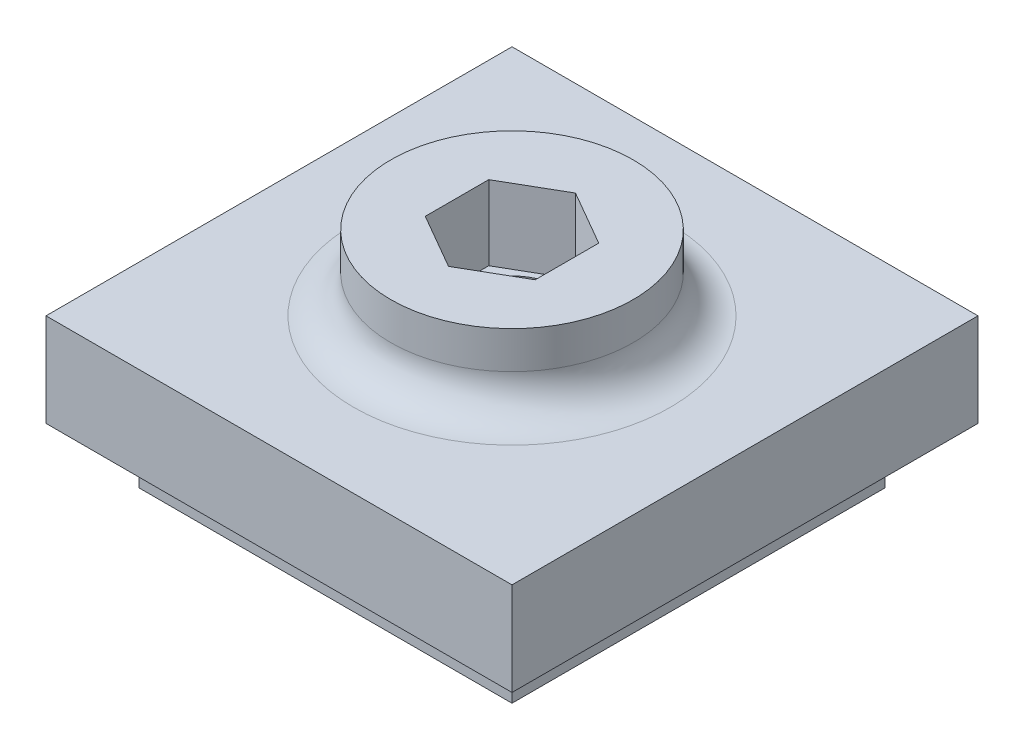
ISO-10303-21;
HEADER;
FILE_DESCRIPTION(('STEP AP214'),'2;1');
FILE_NAME('part.step','',(''),(''),'','','');
FILE_SCHEMA(('AUTOMOTIVE_DESIGN { 1 0 10303 214 1 1 1 1 }'));
ENDSEC;
DATA;
#1=APPLICATION_CONTEXT('core data for automotive mechanical design processes');
#2=APPLICATION_PROTOCOL_DEFINITION('international standard','automotive_design',2000,#1);
#3=PRODUCT_CONTEXT('',#1,'mechanical');
#4=PRODUCT('Part','Part','',(#3));
#5=PRODUCT_RELATED_PRODUCT_CATEGORY('part','',(#4));
#6=PRODUCT_DEFINITION_FORMATION('','',#4);
#7=PRODUCT_DEFINITION_CONTEXT('part definition',#1,'design');
#8=PRODUCT_DEFINITION('design','',#6,#7);
#9=PRODUCT_DEFINITION_SHAPE('','',#8);
#10=(LENGTH_UNIT() NAMED_UNIT(*) SI_UNIT(.MILLI.,.METRE.));
#11=(NAMED_UNIT(*) PLANE_ANGLE_UNIT() SI_UNIT($,.RADIAN.));
#12=(NAMED_UNIT(*) SI_UNIT($,.STERADIAN.) SOLID_ANGLE_UNIT());
#13=UNCERTAINTY_MEASURE_WITH_UNIT(LENGTH_MEASURE(1.E-05),#10,'distance_accuracy_value','');
#14=(GEOMETRIC_REPRESENTATION_CONTEXT(3) GLOBAL_UNCERTAINTY_ASSIGNED_CONTEXT((#13)) GLOBAL_UNIT_ASSIGNED_CONTEXT((#10,
#11,#12)) REPRESENTATION_CONTEXT('',''));
#15=CARTESIAN_POINT('',(0.,0.,0.));
#16=DIRECTION('',(0.,0.,1.));
#17=DIRECTION('',(1.,0.,0.));
#18=AXIS2_PLACEMENT_3D('',#15,#16,#17);
#19=CARTESIAN_POINT('',(0.,-3.,0.));
#20=DIRECTION('',(0.,1.,0.));
#21=DIRECTION('',(0.,0.,1.));
#22=AXIS2_PLACEMENT_3D('',#19,#20,#21);
#23=CYLINDRICAL_SURFACE('',#22,2.62000000000002);
#24=CARTESIAN_POINT('',(0.,-3.,0.));
#25=DIRECTION('',(0.,1.,0.));
#26=DIRECTION('',(0.,0.,1.));
#27=AXIS2_PLACEMENT_3D('',#24,#25,#26);
#28=CIRCLE('',#27,2.62000000000002);
#29=CARTESIAN_POINT('',(0.,-3.,2.62000000000002));
#30=VERTEX_POINT('',#29);
#31=EDGE_CURVE('E186',#30,#30,#28,.T.);
#32=ORIENTED_EDGE('',*,*,#31,.F.);
#33=EDGE_LOOP('',(#32));
#34=FACE_BOUND('',#33,.T.);
#35=CARTESIAN_POINT('',(0.,5.,0.));
#36=DIRECTION('',(0.,1.,0.));
#37=DIRECTION('',(0.,0.,1.));
#38=AXIS2_PLACEMENT_3D('',#35,#36,#37);
#39=CIRCLE('',#38,2.62000000000002);
#40=CARTESIAN_POINT('',(0.,5.,2.62000000000002));
#41=VERTEX_POINT('',#40);
#42=EDGE_CURVE('E184',#41,#41,#39,.F.);
#43=ORIENTED_EDGE('',*,*,#42,.F.);
#44=EDGE_LOOP('',(#43));
#45=FACE_BOUND('',#44,.T.);
#46=ADVANCED_FACE('F38',(#34,#45),#23,.F.);
#47=CARTESIAN_POINT('',(0.,0.,0.));
#48=DIRECTION('',(0.,1.,0.));
#49=DIRECTION('',(0.,0.,1.));
#50=AXIS2_PLACEMENT_3D('',#47,#48,#49);
#51=PLANE('',#50);
#52=DIRECTION('',(0.,0.,-1.));
#53=VECTOR('',#52,1.);
#54=CARTESIAN_POINT('',(-12.5000000000001,0.,0.));
#55=LINE('',#54,#53);
#56=CARTESIAN_POINT('',(-12.5000000000001,0.,12.5));
#57=VERTEX_POINT('',#56);
#58=CARTESIAN_POINT('',(-12.5000000000001,0.,-12.5));
#59=VERTEX_POINT('',#58);
#60=EDGE_CURVE('E222',#57,#59,#55,.T.);
#61=ORIENTED_EDGE('',*,*,#60,.T.);
#62=DIRECTION('',(1.,0.,0.));
#63=VECTOR('',#62,1.);
#64=CARTESIAN_POINT('',(0.,0.,-12.5));
#65=LINE('',#64,#63);
#66=CARTESIAN_POINT('',(12.5,0.,-12.5));
#67=VERTEX_POINT('',#66);
#68=EDGE_CURVE('E227',#59,#67,#65,.T.);
#69=ORIENTED_EDGE('',*,*,#68,.T.);
#70=DIRECTION('',(0.,0.,-1.));
#71=VECTOR('',#70,1.);
#72=CARTESIAN_POINT('',(12.5,0.,0.));
#73=LINE('',#72,#71);
#74=CARTESIAN_POINT('',(12.5,0.,12.5));
#75=VERTEX_POINT('',#74);
#76=EDGE_CURVE('E239',#75,#67,#73,.T.);
#77=ORIENTED_EDGE('',*,*,#76,.F.);
#78=DIRECTION('',(1.,0.,0.));
#79=VECTOR('',#78,1.);
#80=CARTESIAN_POINT('',(0.,0.,12.5));
#81=LINE('',#80,#79);
#82=EDGE_CURVE('E237',#57,#75,#81,.T.);
#83=ORIENTED_EDGE('',*,*,#82,.F.);
#84=EDGE_LOOP('',(#61,#69,#77,#83));
#85=FACE_BOUND('',#84,.T.);
#86=DIRECTION('',(0.,0.,-1.));
#87=VECTOR('',#86,1.);
#88=CARTESIAN_POINT('',(-10.0000000000001,0.,9.99999999999999));
#89=LINE('',#88,#87);
#90=CARTESIAN_POINT('',(-10.0000000000001,0.,9.99999999999999));
#91=VERTEX_POINT('',#90);
#92=CARTESIAN_POINT('',(-10.0000000000001,0.,-10.));
#93=VERTEX_POINT('',#92);
#94=EDGE_CURVE('E61',#91,#93,#89,.T.);
#95=ORIENTED_EDGE('',*,*,#94,.F.);
#96=DIRECTION('',(-1.,0.,0.));
#97=VECTOR('',#96,1.);
#98=CARTESIAN_POINT('',(-10.0000000000001,0.,9.99999999999999));
#99=LINE('',#98,#97);
#100=CARTESIAN_POINT('',(9.99999999999995,0.,9.99999999999999));
#101=VERTEX_POINT('',#100);
#102=EDGE_CURVE('E196',#101,#91,#99,.T.);
#103=ORIENTED_EDGE('',*,*,#102,.F.);
#104=DIRECTION('',(0.,0.,1.));
#105=VECTOR('',#104,1.);
#106=CARTESIAN_POINT('',(9.99999999999995,0.,9.99999999999999));
#107=LINE('',#106,#105);
#108=CARTESIAN_POINT('',(9.99999999999995,0.,-10.));
#109=VERTEX_POINT('',#108);
#110=EDGE_CURVE('E207',#109,#101,#107,.T.);
#111=ORIENTED_EDGE('',*,*,#110,.F.);
#112=DIRECTION('',(1.,0.,0.));
#113=VECTOR('',#112,1.);
#114=CARTESIAN_POINT('',(-10.0000000000001,0.,-10.));
#115=LINE('',#114,#113);
#116=EDGE_CURVE('E204',#93,#109,#115,.T.);
#117=ORIENTED_EDGE('',*,*,#116,.F.);
#118=EDGE_LOOP('',(#95,#103,#111,#117));
#119=FACE_BOUND('',#118,.T.);
#120=ADVANCED_FACE('F267',(#85,#119),#51,.F.);
#121=CARTESIAN_POINT('',(-12.5000000000001,5.,0.));
#122=DIRECTION('',(-1.,0.,0.));
#123=DIRECTION('',(0.,0.,1.));
#124=AXIS2_PLACEMENT_3D('',#121,#122,#123);
#125=PLANE('',#124);
#126=ORIENTED_EDGE('',*,*,#60,.F.);
#127=DIRECTION('',(0.,-1.,0.));
#128=VECTOR('',#127,1.);
#129=CARTESIAN_POINT('',(-12.5000000000001,5.,12.5));
#130=LINE('',#129,#128);
#131=CARTESIAN_POINT('',(-12.5000000000001,5.,12.5));
#132=VERTEX_POINT('',#131);
#133=EDGE_CURVE('E250',#132,#57,#130,.T.);
#134=ORIENTED_EDGE('',*,*,#133,.F.);
#135=DIRECTION('',(0.,0.,-1.));
#136=VECTOR('',#135,1.);
#137=CARTESIAN_POINT('',(-12.5000000000001,5.,0.));
#138=LINE('',#137,#136);
#139=CARTESIAN_POINT('',(-12.5000000000001,5.,-12.5));
#140=VERTEX_POINT('',#139);
#141=EDGE_CURVE('E223',#132,#140,#138,.T.);
#142=ORIENTED_EDGE('',*,*,#141,.T.);
#143=DIRECTION('',(0.,-1.,0.));
#144=VECTOR('',#143,1.);
#145=CARTESIAN_POINT('',(-12.5000000000001,5.,-12.5));
#146=LINE('',#145,#144);
#147=EDGE_CURVE('E234',#140,#59,#146,.T.);
#148=ORIENTED_EDGE('',*,*,#147,.T.);
#149=EDGE_LOOP('',(#126,#134,#142,#148));
#150=FACE_BOUND('',#149,.T.);
#151=ADVANCED_FACE('F273',(#150),#125,.T.);
#152=CARTESIAN_POINT('',(0.,5.,12.5));
#153=DIRECTION('',(0.,0.,-1.));
#154=DIRECTION('',(-1.,0.,0.));
#155=AXIS2_PLACEMENT_3D('',#152,#153,#154);
#156=PLANE('',#155);
#157=ORIENTED_EDGE('',*,*,#82,.T.);
#158=DIRECTION('',(0.,-1.,0.));
#159=VECTOR('',#158,1.);
#160=CARTESIAN_POINT('',(12.5,5.,12.5));
#161=LINE('',#160,#159);
#162=CARTESIAN_POINT('',(12.5,5.,12.5));
#163=VERTEX_POINT('',#162);
#164=EDGE_CURVE('E247',#163,#75,#161,.T.);
#165=ORIENTED_EDGE('',*,*,#164,.F.);
#166=DIRECTION('',(1.,0.,0.));
#167=VECTOR('',#166,1.);
#168=CARTESIAN_POINT('',(0.,5.,12.5));
#169=LINE('',#168,#167);
#170=EDGE_CURVE('E226',#132,#163,#169,.T.);
#171=ORIENTED_EDGE('',*,*,#170,.F.);
#172=ORIENTED_EDGE('',*,*,#133,.T.);
#173=EDGE_LOOP('',(#157,#165,#171,#172));
#174=FACE_BOUND('',#173,.T.);
#175=ADVANCED_FACE('F317',(#174),#156,.F.);
#176=CARTESIAN_POINT('',(12.5,5.,0.));
#177=DIRECTION('',(-1.,0.,0.));
#178=DIRECTION('',(0.,0.,1.));
#179=AXIS2_PLACEMENT_3D('',#176,#177,#178);
#180=PLANE('',#179);
#181=ORIENTED_EDGE('',*,*,#76,.T.);
#182=DIRECTION('',(0.,-1.,0.));
#183=VECTOR('',#182,1.);
#184=CARTESIAN_POINT('',(12.5,5.,-12.5));
#185=LINE('',#184,#183);
#186=CARTESIAN_POINT('',(12.5,5.,-12.5));
#187=VERTEX_POINT('',#186);
#188=EDGE_CURVE('E245',#187,#67,#185,.T.);
#189=ORIENTED_EDGE('',*,*,#188,.F.);
#190=DIRECTION('',(0.,0.,-1.));
#191=VECTOR('',#190,1.);
#192=CARTESIAN_POINT('',(12.5,5.,0.));
#193=LINE('',#192,#191);
#194=EDGE_CURVE('E229',#163,#187,#193,.T.);
#195=ORIENTED_EDGE('',*,*,#194,.F.);
#196=ORIENTED_EDGE('',*,*,#164,.T.);
#197=EDGE_LOOP('',(#181,#189,#195,#196));
#198=FACE_BOUND('',#197,.T.);
#199=ADVANCED_FACE('F313',(#198),#180,.F.);
#200=CARTESIAN_POINT('',(0.,5.,-12.5));
#201=DIRECTION('',(0.,0.,-1.));
#202=DIRECTION('',(-1.,0.,0.));
#203=AXIS2_PLACEMENT_3D('',#200,#201,#202);
#204=PLANE('',#203);
#205=ORIENTED_EDGE('',*,*,#68,.F.);
#206=ORIENTED_EDGE('',*,*,#147,.F.);
#207=DIRECTION('',(1.,0.,0.));
#208=VECTOR('',#207,1.);
#209=CARTESIAN_POINT('',(0.,5.,-12.5));
#210=LINE('',#209,#208);
#211=EDGE_CURVE('E231',#140,#187,#210,.T.);
#212=ORIENTED_EDGE('',*,*,#211,.T.);
#213=ORIENTED_EDGE('',*,*,#188,.T.);
#214=EDGE_LOOP('',(#205,#206,#212,#213));
#215=FACE_BOUND('',#214,.T.);
#216=ADVANCED_FACE('F308',(#215),#204,.T.);
#217=CARTESIAN_POINT('',(0.,5.,0.));
#218=DIRECTION('',(0.,1.,0.));
#219=DIRECTION('',(0.,0.,1.));
#220=AXIS2_PLACEMENT_3D('',#217,#218,#219);
#221=PLANE('',#220);
#222=CARTESIAN_POINT('',(0.,5.,0.));
#223=DIRECTION('',(0.,1.,0.));
#224=DIRECTION('',(0.,0.,1.));
#225=AXIS2_PLACEMENT_3D('',#222,#223,#224);
#226=CIRCLE('',#225,8.50000000000001);
#227=CARTESIAN_POINT('',(0.,5.,8.50000000000001));
#228=VERTEX_POINT('',#227);
#229=EDGE_CURVE('E11',#228,#228,#226,.F.);
#230=ORIENTED_EDGE('',*,*,#229,.T.);
#231=EDGE_LOOP('',(#230));
#232=FACE_BOUND('',#231,.T.);
#233=ORIENTED_EDGE('',*,*,#141,.F.);
#234=ORIENTED_EDGE('',*,*,#170,.T.);
#235=ORIENTED_EDGE('',*,*,#194,.T.);
#236=ORIENTED_EDGE('',*,*,#211,.F.);
#237=EDGE_LOOP('',(#233,#234,#235,#236));
#238=FACE_BOUND('',#237,.T.);
#239=ADVANCED_FACE('F305',(#232,#238),#221,.T.);
#240=CARTESIAN_POINT('',(-10.0000000000001,-3.,9.99999999999999));
#241=DIRECTION('',(1.,0.,0.));
#242=DIRECTION('',(0.,0.,-1.));
#243=AXIS2_PLACEMENT_3D('',#240,#241,#242);
#244=PLANE('',#243);
#245=ORIENTED_EDGE('',*,*,#94,.T.);
#246=DIRECTION('',(0.,1.,0.));
#247=VECTOR('',#246,1.);
#248=CARTESIAN_POINT('',(-10.0000000000001,-3.,-10.));
#249=LINE('',#248,#247);
#250=CARTESIAN_POINT('',(-10.0000000000001,-3.,-10.));
#251=VERTEX_POINT('',#250);
#252=EDGE_CURVE('E219',#251,#93,#249,.T.);
#253=ORIENTED_EDGE('',*,*,#252,.F.);
#254=DIRECTION('',(0.,0.,-1.));
#255=VECTOR('',#254,1.);
#256=CARTESIAN_POINT('',(-10.0000000000001,-3.,9.99999999999999));
#257=LINE('',#256,#255);
#258=CARTESIAN_POINT('',(-10.0000000000001,-3.,9.99999999999999));
#259=VERTEX_POINT('',#258);
#260=EDGE_CURVE('E192',#259,#251,#257,.T.);
#261=ORIENTED_EDGE('',*,*,#260,.F.);
#262=DIRECTION('',(0.,1.,0.));
#263=VECTOR('',#262,1.);
#264=CARTESIAN_POINT('',(-10.0000000000001,-3.,9.99999999999999));
#265=LINE('',#264,#263);
#266=EDGE_CURVE('E202',#259,#91,#265,.T.);
#267=ORIENTED_EDGE('',*,*,#266,.T.);
#268=EDGE_LOOP('',(#245,#253,#261,#267));
#269=FACE_BOUND('',#268,.T.);
#270=ADVANCED_FACE('F301',(#269),#244,.F.);
#271=CARTESIAN_POINT('',(-10.0000000000001,-3.,-10.));
#272=DIRECTION('',(0.,0.,1.));
#273=DIRECTION('',(1.,0.,0.));
#274=AXIS2_PLACEMENT_3D('',#271,#272,#273);
#275=PLANE('',#274);
#276=ORIENTED_EDGE('',*,*,#116,.T.);
#277=DIRECTION('',(0.,1.,0.));
#278=VECTOR('',#277,1.);
#279=CARTESIAN_POINT('',(9.99999999999995,-3.,-10.));
#280=LINE('',#279,#278);
#281=CARTESIAN_POINT('',(9.99999999999995,-3.,-10.));
#282=VERTEX_POINT('',#281);
#283=EDGE_CURVE('E216',#282,#109,#280,.T.);
#284=ORIENTED_EDGE('',*,*,#283,.F.);
#285=DIRECTION('',(1.,0.,0.));
#286=VECTOR('',#285,1.);
#287=CARTESIAN_POINT('',(-10.0000000000001,-3.,-10.));
#288=LINE('',#287,#286);
#289=EDGE_CURVE('E195',#251,#282,#288,.T.);
#290=ORIENTED_EDGE('',*,*,#289,.F.);
#291=ORIENTED_EDGE('',*,*,#252,.T.);
#292=EDGE_LOOP('',(#276,#284,#290,#291));
#293=FACE_BOUND('',#292,.T.);
#294=ADVANCED_FACE('F297',(#293),#275,.F.);
#295=CARTESIAN_POINT('',(9.99999999999995,-3.,9.99999999999999));
#296=DIRECTION('',(-1.,0.,0.));
#297=DIRECTION('',(0.,0.,1.));
#298=AXIS2_PLACEMENT_3D('',#295,#296,#297);
#299=PLANE('',#298);
#300=ORIENTED_EDGE('',*,*,#110,.T.);
#301=DIRECTION('',(0.,1.,0.));
#302=VECTOR('',#301,1.);
#303=CARTESIAN_POINT('',(9.99999999999995,-3.,9.99999999999999));
#304=LINE('',#303,#302);
#305=CARTESIAN_POINT('',(9.99999999999995,-3.,9.99999999999999));
#306=VERTEX_POINT('',#305);
#307=EDGE_CURVE('E213',#306,#101,#304,.T.);
#308=ORIENTED_EDGE('',*,*,#307,.F.);
#309=DIRECTION('',(0.,0.,1.));
#310=VECTOR('',#309,1.);
#311=CARTESIAN_POINT('',(9.99999999999995,-3.,9.99999999999999));
#312=LINE('',#311,#310);
#313=EDGE_CURVE('E198',#282,#306,#312,.T.);
#314=ORIENTED_EDGE('',*,*,#313,.F.);
#315=ORIENTED_EDGE('',*,*,#283,.T.);
#316=EDGE_LOOP('',(#300,#308,#314,#315));
#317=FACE_BOUND('',#316,.T.);
#318=ADVANCED_FACE('F293',(#317),#299,.F.);
#319=CARTESIAN_POINT('',(-10.0000000000001,-3.,9.99999999999999));
#320=DIRECTION('',(0.,0.,-1.));
#321=DIRECTION('',(-1.,0.,0.));
#322=AXIS2_PLACEMENT_3D('',#319,#320,#321);
#323=PLANE('',#322);
#324=ORIENTED_EDGE('',*,*,#102,.T.);
#325=ORIENTED_EDGE('',*,*,#266,.F.);
#326=DIRECTION('',(-1.,0.,0.));
#327=VECTOR('',#326,1.);
#328=CARTESIAN_POINT('',(-10.0000000000001,-3.,9.99999999999999));
#329=LINE('',#328,#327);
#330=EDGE_CURVE('E200',#306,#259,#329,.T.);
#331=ORIENTED_EDGE('',*,*,#330,.F.);
#332=ORIENTED_EDGE('',*,*,#307,.T.);
#333=EDGE_LOOP('',(#324,#325,#331,#332));
#334=FACE_BOUND('',#333,.T.);
#335=ADVANCED_FACE('F289',(#334),#323,.F.);
#336=CARTESIAN_POINT('',(0.,-3.,0.));
#337=DIRECTION('',(0.,-1.,0.));
#338=DIRECTION('',(0.,0.,-1.));
#339=AXIS2_PLACEMENT_3D('',#336,#337,#338);
#340=PLANE('',#339);
#341=ORIENTED_EDGE('',*,*,#31,.T.);
#342=EDGE_LOOP('',(#341));
#343=FACE_BOUND('',#342,.T.);
#344=ORIENTED_EDGE('',*,*,#260,.T.);
#345=ORIENTED_EDGE('',*,*,#289,.T.);
#346=ORIENTED_EDGE('',*,*,#313,.T.);
#347=ORIENTED_EDGE('',*,*,#330,.T.);
#348=EDGE_LOOP('',(#344,#345,#346,#347));
#349=FACE_BOUND('',#348,.T.);
#350=ADVANCED_FACE('F286',(#343,#349),#340,.T.);
#351=CARTESIAN_POINT('',(0.,9.,0.));
#352=DIRECTION('',(0.,-1.,0.));
#353=DIRECTION('',(0.,0.,-1.));
#354=AXIS2_PLACEMENT_3D('',#351,#352,#353);
#355=CYLINDRICAL_SURFACE('',#354,6.50000000000001);
#356=CARTESIAN_POINT('',(0.,7.,0.));
#357=DIRECTION('',(0.,1.,0.));
#358=DIRECTION('',(0.,0.,1.));
#359=AXIS2_PLACEMENT_3D('',#356,#357,#358);
#360=CIRCLE('',#359,6.50000000000001);
#361=CARTESIAN_POINT('',(0.,7.,6.50000000000001));
#362=VERTEX_POINT('',#361);
#363=EDGE_CURVE('E46',#362,#362,#360,.T.);
#364=ORIENTED_EDGE('',*,*,#363,.T.);
#365=EDGE_LOOP('',(#364));
#366=FACE_BOUND('',#365,.T.);
#367=CARTESIAN_POINT('',(0.,9.,0.));
#368=DIRECTION('',(0.,1.,0.));
#369=DIRECTION('',(0.,0.,1.));
#370=AXIS2_PLACEMENT_3D('',#367,#368,#369);
#371=CIRCLE('',#370,6.50000000000001);
#372=CARTESIAN_POINT('',(0.,9.,6.50000000000001));
#373=VERTEX_POINT('',#372);
#374=EDGE_CURVE('E189',#373,#373,#371,.T.);
#375=ORIENTED_EDGE('',*,*,#374,.F.);
#376=EDGE_LOOP('',(#375));
#377=FACE_BOUND('',#376,.T.);
#378=ADVANCED_FACE('F256',(#366,#377),#355,.T.);
#379=CARTESIAN_POINT('',(0.,9.,0.));
#380=DIRECTION('',(0.,1.,0.));
#381=DIRECTION('',(0.,0.,1.));
#382=AXIS2_PLACEMENT_3D('',#379,#380,#381);
#383=PLANE('',#382);
#384=DIRECTION('',(-0.86602540378444,0.,-0.499999999999998));
#385=VECTOR('',#384,1.);
#386=CARTESIAN_POINT('',(2.94999999999995,9.,-1.70318329410937));
#387=LINE('',#386,#385);
#388=CARTESIAN_POINT('',(2.94999999999995,9.,-1.70318329410937));
#389=VERTEX_POINT('',#388);
#390=CARTESIAN_POINT('',(0.,9.,-3.40636658821877));
#391=VERTEX_POINT('',#390);
#392=EDGE_CURVE('E53',#389,#391,#387,.T.);
#393=ORIENTED_EDGE('',*,*,#392,.F.);
#394=DIRECTION('',(0.,0.,-1.));
#395=VECTOR('',#394,1.);
#396=CARTESIAN_POINT('',(2.94999999999995,9.,1.70318329410941));
#397=LINE('',#396,#395);
#398=CARTESIAN_POINT('',(2.94999999999995,9.,1.70318329410941));
#399=VERTEX_POINT('',#398);
#400=EDGE_CURVE('E171',#399,#389,#397,.T.);
#401=ORIENTED_EDGE('',*,*,#400,.F.);
#402=DIRECTION('',(0.86602540378444,0.,-0.499999999999997));
#403=VECTOR('',#402,1.);
#404=CARTESIAN_POINT('',(0.,9.,3.40636658821879));
#405=LINE('',#404,#403);
#406=CARTESIAN_POINT('',(0.,9.,3.40636658821879));
#407=VERTEX_POINT('',#406);
#408=EDGE_CURVE('E165',#407,#399,#405,.T.);
#409=ORIENTED_EDGE('',*,*,#408,.F.);
#410=DIRECTION('',(0.866025403784437,0.,0.500000000000002));
#411=VECTOR('',#410,1.);
#412=CARTESIAN_POINT('',(-2.95000000000001,9.,1.70318329410941));
#413=LINE('',#412,#411);
#414=CARTESIAN_POINT('',(-2.95000000000001,9.,1.70318329410941));
#415=VERTEX_POINT('',#414);
#416=EDGE_CURVE('E163',#415,#407,#413,.T.);
#417=ORIENTED_EDGE('',*,*,#416,.F.);
#418=DIRECTION('',(0.,0.,1.));
#419=VECTOR('',#418,1.);
#420=CARTESIAN_POINT('',(-2.95000000000001,9.,-1.70318329410939));
#421=LINE('',#420,#419);
#422=CARTESIAN_POINT('',(-2.95000000000001,9.,-1.70318329410939));
#423=VERTEX_POINT('',#422);
#424=EDGE_CURVE('E145',#423,#415,#421,.T.);
#425=ORIENTED_EDGE('',*,*,#424,.F.);
#426=DIRECTION('',(-0.866025403784437,0.,0.500000000000002));
#427=VECTOR('',#426,1.);
#428=CARTESIAN_POINT('',(0.,9.,-3.40636658821877));
#429=LINE('',#428,#427);
#430=EDGE_CURVE('E155',#391,#423,#429,.T.);
#431=ORIENTED_EDGE('',*,*,#430,.F.);
#432=EDGE_LOOP('',(#393,#401,#409,#417,#425,#431));
#433=FACE_BOUND('',#432,.T.);
#434=ORIENTED_EDGE('',*,*,#374,.T.);
#435=EDGE_LOOP('',(#434));
#436=FACE_BOUND('',#435,.T.);
#437=ADVANCED_FACE('F159',(#433,#436),#383,.T.);
#438=CARTESIAN_POINT('',(0.,5.,0.));
#439=DIRECTION('',(0.,1.,0.));
#440=DIRECTION('',(0.,0.,1.));
#441=AXIS2_PLACEMENT_3D('',#438,#439,#440);
#442=PLANE('',#441);
#443=DIRECTION('',(0.86602540378444,0.,0.499999999999999));
#444=VECTOR('',#443,1.);
#445=CARTESIAN_POINT('',(2.94999999999995,5.,-1.70318329410937));
#446=LINE('',#445,#444);
#447=CARTESIAN_POINT('',(0.,5.,-3.40636658821877));
#448=VERTEX_POINT('',#447);
#449=CARTESIAN_POINT('',(2.94999999999995,5.,-1.70318329410937));
#450=VERTEX_POINT('',#449);
#451=EDGE_CURVE('E185',#448,#450,#446,.T.);
#452=ORIENTED_EDGE('',*,*,#451,.F.);
#453=DIRECTION('',(0.866025403784437,0.,-0.500000000000002));
#454=VECTOR('',#453,1.);
#455=CARTESIAN_POINT('',(0.,5.,-3.40636658821877));
#456=LINE('',#455,#454);
#457=CARTESIAN_POINT('',(-2.95000000000001,5.,-1.70318329410939));
#458=VERTEX_POINT('',#457);
#459=EDGE_CURVE('E182',#458,#448,#456,.T.);
#460=ORIENTED_EDGE('',*,*,#459,.F.);
#461=DIRECTION('',(0.,0.,-1.));
#462=VECTOR('',#461,1.);
#463=CARTESIAN_POINT('',(-2.95000000000001,5.,-1.70318329410939));
#464=LINE('',#463,#462);
#465=CARTESIAN_POINT('',(-2.95000000000001,5.,1.70318329410941));
#466=VERTEX_POINT('',#465);
#467=EDGE_CURVE('E148',#466,#458,#464,.T.);
#468=ORIENTED_EDGE('',*,*,#467,.F.);
#469=DIRECTION('',(-0.866025403784437,0.,-0.500000000000002));
#470=VECTOR('',#469,1.);
#471=CARTESIAN_POINT('',(-2.95000000000001,5.,1.70318329410941));
#472=LINE('',#471,#470);
#473=CARTESIAN_POINT('',(0.,5.,3.40636658821879));
#474=VERTEX_POINT('',#473);
#475=EDGE_CURVE('E535',#474,#466,#472,.T.);
#476=ORIENTED_EDGE('',*,*,#475,.F.);
#477=DIRECTION('',(-0.866025403784441,0.,0.499999999999997));
#478=VECTOR('',#477,1.);
#479=CARTESIAN_POINT('',(0.,5.,3.40636658821879));
#480=LINE('',#479,#478);
#481=CARTESIAN_POINT('',(2.94999999999995,5.,1.70318329410941));
#482=VERTEX_POINT('',#481);
#483=EDGE_CURVE('E537',#482,#474,#480,.T.);
#484=ORIENTED_EDGE('',*,*,#483,.F.);
#485=DIRECTION('',(0.,0.,1.));
#486=VECTOR('',#485,1.);
#487=CARTESIAN_POINT('',(2.94999999999995,5.,1.70318329410941));
#488=LINE('',#487,#486);
#489=EDGE_CURVE('E544',#450,#482,#488,.T.);
#490=ORIENTED_EDGE('',*,*,#489,.F.);
#491=EDGE_LOOP('',(#452,#460,#468,#476,#484,#490));
#492=FACE_BOUND('',#491,.T.);
#493=ORIENTED_EDGE('',*,*,#42,.T.);
#494=EDGE_LOOP('',(#493));
#495=FACE_BOUND('',#494,.T.);
#496=ADVANCED_FACE('F283',(#492,#495),#442,.T.);
#497=CARTESIAN_POINT('',(2.94999999999995,-4.01239886674644,-1.70318329410937));
#498=DIRECTION('',(0.499999999999999,0.,-0.86602540378444));
#499=DIRECTION('',(-0.86602540378444,0.,-0.499999999999999));
#500=AXIS2_PLACEMENT_3D('',#497,#498,#499);
#501=PLANE('',#500);
#502=ORIENTED_EDGE('',*,*,#451,.T.);
#503=DIRECTION('',(0.,1.,0.));
#504=VECTOR('',#503,1.);
#505=CARTESIAN_POINT('',(2.94999999999995,-4.01239886674644,-1.70318329410937));
#506=LINE('',#505,#504);
#507=EDGE_CURVE('E174',#450,#389,#506,.T.);
#508=ORIENTED_EDGE('',*,*,#507,.T.);
#509=ORIENTED_EDGE('',*,*,#392,.T.);
#510=DIRECTION('',(0.,1.,0.));
#511=VECTOR('',#510,1.);
#512=CARTESIAN_POINT('',(0.,-4.01239886674644,-3.40636658821877));
#513=LINE('',#512,#511);
#514=EDGE_CURVE('E152',#448,#391,#513,.T.);
#515=ORIENTED_EDGE('',*,*,#514,.F.);
#516=EDGE_LOOP('',(#502,#508,#509,#515));
#517=FACE_BOUND('',#516,.T.);
#518=ADVANCED_FACE('F280',(#517),#501,.F.);
#519=CARTESIAN_POINT('',(2.94999999999995,-4.01239886674644,1.70318329410941));
#520=DIRECTION('',(1.,0.,0.));
#521=DIRECTION('',(0.,0.,-1.));
#522=AXIS2_PLACEMENT_3D('',#519,#520,#521);
#523=PLANE('',#522);
#524=ORIENTED_EDGE('',*,*,#489,.T.);
#525=DIRECTION('',(0.,1.,0.));
#526=VECTOR('',#525,1.);
#527=CARTESIAN_POINT('',(2.94999999999995,-4.01239886674644,1.70318329410941));
#528=LINE('',#527,#526);
#529=EDGE_CURVE('E176',#482,#399,#528,.T.);
#530=ORIENTED_EDGE('',*,*,#529,.T.);
#531=ORIENTED_EDGE('',*,*,#400,.T.);
#532=ORIENTED_EDGE('',*,*,#507,.F.);
#533=EDGE_LOOP('',(#524,#530,#531,#532));
#534=FACE_BOUND('',#533,.T.);
#535=ADVANCED_FACE('F396',(#534),#523,.F.);
#536=CARTESIAN_POINT('',(0.,-4.01239886674644,3.40636658821879));
#537=DIRECTION('',(0.499999999999997,0.,0.866025403784441));
#538=DIRECTION('',(0.866025403784441,0.,-0.499999999999997));
#539=AXIS2_PLACEMENT_3D('',#536,#537,#538);
#540=PLANE('',#539);
#541=ORIENTED_EDGE('',*,*,#483,.T.);
#542=DIRECTION('',(0.,1.,0.));
#543=VECTOR('',#542,1.);
#544=CARTESIAN_POINT('',(0.,-4.01239886674644,3.40636658821879));
#545=LINE('',#544,#543);
#546=EDGE_CURVE('E178',#474,#407,#545,.T.);
#547=ORIENTED_EDGE('',*,*,#546,.T.);
#548=ORIENTED_EDGE('',*,*,#408,.T.);
#549=ORIENTED_EDGE('',*,*,#529,.F.);
#550=EDGE_LOOP('',(#541,#547,#548,#549));
#551=FACE_BOUND('',#550,.T.);
#552=ADVANCED_FACE('F402',(#551),#540,.F.);
#553=CARTESIAN_POINT('',(-2.95000000000001,-4.01239886674644,1.70318329410941));
#554=DIRECTION('',(-0.500000000000002,0.,0.866025403784437));
#555=DIRECTION('',(0.866025403784437,0.,0.500000000000002));
#556=AXIS2_PLACEMENT_3D('',#553,#554,#555);
#557=PLANE('',#556);
#558=ORIENTED_EDGE('',*,*,#475,.T.);
#559=DIRECTION('',(0.,1.,0.));
#560=VECTOR('',#559,1.);
#561=CARTESIAN_POINT('',(-2.95000000000001,-4.01239886674644,1.70318329410941));
#562=LINE('',#561,#560);
#563=EDGE_CURVE('E151',#466,#415,#562,.T.);
#564=ORIENTED_EDGE('',*,*,#563,.T.);
#565=ORIENTED_EDGE('',*,*,#416,.T.);
#566=ORIENTED_EDGE('',*,*,#546,.F.);
#567=EDGE_LOOP('',(#558,#564,#565,#566));
#568=FACE_BOUND('',#567,.T.);
#569=ADVANCED_FACE('F410',(#568),#557,.F.);
#570=CARTESIAN_POINT('',(-2.95000000000001,-4.01239886674644,-1.70318329410939));
#571=DIRECTION('',(-1.,0.,0.));
#572=DIRECTION('',(0.,0.,1.));
#573=AXIS2_PLACEMENT_3D('',#570,#571,#572);
#574=PLANE('',#573);
#575=ORIENTED_EDGE('',*,*,#467,.T.);
#576=DIRECTION('',(0.,1.,0.));
#577=VECTOR('',#576,1.);
#578=CARTESIAN_POINT('',(-2.95000000000001,-4.01239886674644,-1.70318329410939));
#579=LINE('',#578,#577);
#580=EDGE_CURVE('E140',#458,#423,#579,.T.);
#581=ORIENTED_EDGE('',*,*,#580,.T.);
#582=ORIENTED_EDGE('',*,*,#424,.T.);
#583=ORIENTED_EDGE('',*,*,#563,.F.);
#584=EDGE_LOOP('',(#575,#581,#582,#583));
#585=FACE_BOUND('',#584,.T.);
#586=ADVANCED_FACE('F142',(#585),#574,.F.);
#587=CARTESIAN_POINT('',(0.,-4.01239886674644,-3.40636658821877));
#588=DIRECTION('',(-0.500000000000002,0.,-0.866025403784437));
#589=DIRECTION('',(-0.866025403784437,0.,0.500000000000002));
#590=AXIS2_PLACEMENT_3D('',#587,#588,#589);
#591=PLANE('',#590);
#592=ORIENTED_EDGE('',*,*,#459,.T.);
#593=ORIENTED_EDGE('',*,*,#514,.T.);
#594=ORIENTED_EDGE('',*,*,#430,.T.);
#595=ORIENTED_EDGE('',*,*,#580,.F.);
#596=EDGE_LOOP('',(#592,#593,#594,#595));
#597=FACE_BOUND('',#596,.T.);
#598=ADVANCED_FACE('F156',(#597),#591,.F.);
#599=CARTESIAN_POINT('',(0.,7.,0.));
#600=DIRECTION('',(0.,1.,0.));
#601=DIRECTION('',(0.,0.,1.));
#602=AXIS2_PLACEMENT_3D('',#599,#600,#601);
#603=TOROIDAL_SURFACE('',#602,8.50000000000001,2.);
#604=ORIENTED_EDGE('',*,*,#229,.F.);
#605=EDGE_LOOP('',(#604));
#606=FACE_BOUND('',#605,.T.);
#607=ORIENTED_EDGE('',*,*,#363,.F.);
#608=EDGE_LOOP('',(#607));
#609=FACE_BOUND('',#608,.T.);
#610=ADVANCED_FACE('F40',(#606,#609),#603,.F.);
#611=CLOSED_SHELL('',(#46,#120,#151,#175,#199,#216,#239,#270,#294,#318,#335,#350,#378,#437,#496,
#518,#535,#552,#569,#586,#598,#610));
#612=MANIFOLD_SOLID_BREP('B2',#611);
#613=ADVANCED_BREP_SHAPE_REPRESENTATION('',(#18,#612),#14);
#614=SHAPE_DEFINITION_REPRESENTATION(#9,#613);
ENDSEC;
END-ISO-10303-21;
